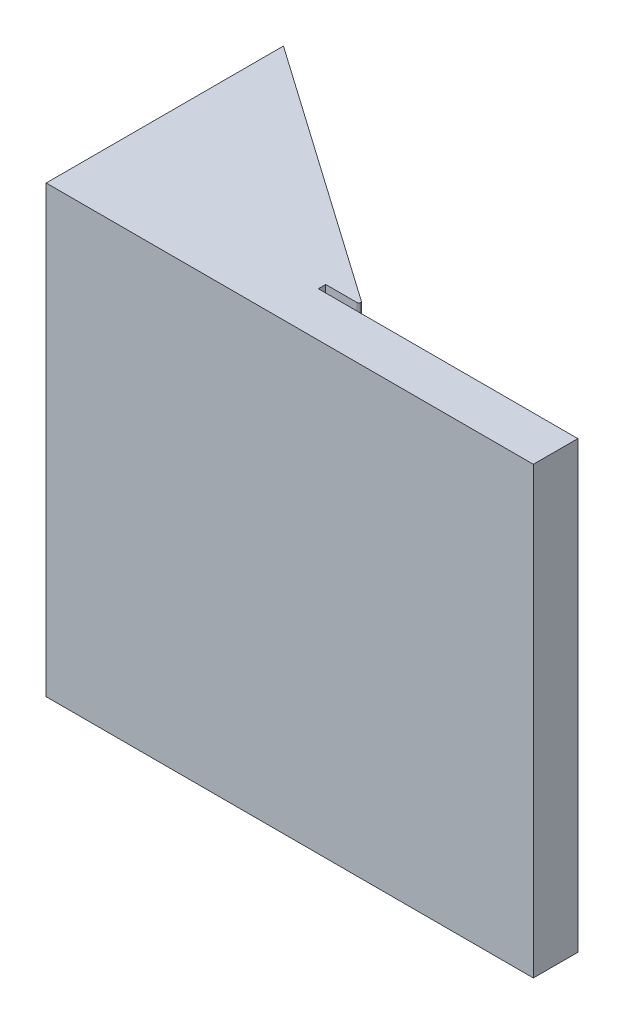
ISO-10303-21;
HEADER;
FILE_DESCRIPTION(('STEP AP214'),'2;1');
FILE_NAME('part.step','',(''),(''),'','','');
FILE_SCHEMA(('AUTOMOTIVE_DESIGN { 1 0 10303 214 1 1 1 1 }'));
ENDSEC;
DATA;
#1=APPLICATION_CONTEXT('core data for automotive mechanical design processes');
#2=APPLICATION_PROTOCOL_DEFINITION('international standard','automotive_design',2000,#1);
#3=PRODUCT_CONTEXT('',#1,'mechanical');
#4=PRODUCT('Part','Part','',(#3));
#5=PRODUCT_RELATED_PRODUCT_CATEGORY('part','',(#4));
#6=PRODUCT_DEFINITION_FORMATION('','',#4);
#7=PRODUCT_DEFINITION_CONTEXT('part definition',#1,'design');
#8=PRODUCT_DEFINITION('design','',#6,#7);
#9=PRODUCT_DEFINITION_SHAPE('','',#8);
#10=(LENGTH_UNIT() NAMED_UNIT(*) SI_UNIT(.MILLI.,.METRE.));
#11=(NAMED_UNIT(*) PLANE_ANGLE_UNIT() SI_UNIT($,.RADIAN.));
#12=(NAMED_UNIT(*) SI_UNIT($,.STERADIAN.) SOLID_ANGLE_UNIT());
#13=UNCERTAINTY_MEASURE_WITH_UNIT(LENGTH_MEASURE(1.E-05),#10,'distance_accuracy_value','');
#14=(GEOMETRIC_REPRESENTATION_CONTEXT(3) GLOBAL_UNCERTAINTY_ASSIGNED_CONTEXT((#13)) GLOBAL_UNIT_ASSIGNED_CONTEXT((#10,
#11,#12)) REPRESENTATION_CONTEXT('',''));
#15=CARTESIAN_POINT('',(0.,0.,0.));
#16=DIRECTION('',(0.,0.,1.));
#17=DIRECTION('',(1.,0.,0.));
#18=AXIS2_PLACEMENT_3D('',#15,#16,#17);
#19=CARTESIAN_POINT('',(-20.,60.,-4.));
#20=DIRECTION('',(-1.,0.,0.));
#21=DIRECTION('',(0.,0.,1.));
#22=AXIS2_PLACEMENT_3D('',#19,#20,#21);
#23=PLANE('',#22);
#24=DIRECTION('',(0.,0.,-1.));
#25=VECTOR('',#24,1.);
#26=CARTESIAN_POINT('',(-20.,0.,-4.));
#27=LINE('',#26,#25);
#28=CARTESIAN_POINT('',(-20.,0.,-3.));
#29=VERTEX_POINT('',#28);
#30=CARTESIAN_POINT('',(-20.,0.,-4.));
#31=VERTEX_POINT('',#30);
#32=EDGE_CURVE('E158',#29,#31,#27,.T.);
#33=ORIENTED_EDGE('',*,*,#32,.T.);
#34=DIRECTION('',(0.,-1.,0.));
#35=VECTOR('',#34,1.);
#36=CARTESIAN_POINT('',(-20.,60.,-4.));
#37=LINE('',#36,#35);
#38=CARTESIAN_POINT('',(-20.,60.,-4.));
#39=VERTEX_POINT('',#38);
#40=EDGE_CURVE('E111',#39,#31,#37,.T.);
#41=ORIENTED_EDGE('',*,*,#40,.F.);
#42=DIRECTION('',(0.,0.,-1.));
#43=VECTOR('',#42,1.);
#44=CARTESIAN_POINT('',(-20.,60.,-4.));
#45=LINE('',#44,#43);
#46=CARTESIAN_POINT('',(-20.,60.,-3.));
#47=VERTEX_POINT('',#46);
#48=EDGE_CURVE('E106',#47,#39,#45,.T.);
#49=ORIENTED_EDGE('',*,*,#48,.F.);
#50=DIRECTION('',(0.,-1.,0.));
#51=VECTOR('',#50,1.);
#52=CARTESIAN_POINT('',(-20.,60.,-3.));
#53=LINE('',#52,#51);
#54=EDGE_CURVE('E109',#47,#29,#53,.T.);
#55=ORIENTED_EDGE('',*,*,#54,.T.);
#56=EDGE_LOOP('',(#33,#41,#49,#55));
#57=FACE_BOUND('',#56,.T.);
#58=ADVANCED_FACE('F41',(#57),#23,.F.);
#59=CARTESIAN_POINT('',(-15.,60.,-4.));
#60=DIRECTION('',(0.,0.,-1.));
#61=DIRECTION('',(-1.,0.,0.));
#62=AXIS2_PLACEMENT_3D('',#59,#60,#61);
#63=PLANE('',#62);
#64=DIRECTION('',(1.,0.,0.));
#65=VECTOR('',#64,1.);
#66=CARTESIAN_POINT('',(-15.,0.,-4.));
#67=LINE('',#66,#65);
#68=CARTESIAN_POINT('',(-15.7928987005908,0.,-4.));
#69=VERTEX_POINT('',#68);
#70=EDGE_CURVE('E156',#31,#69,#67,.T.);
#71=ORIENTED_EDGE('',*,*,#70,.T.);
#72=DIRECTION('',(0.,-1.,0.));
#73=VECTOR('',#72,1.);
#74=CARTESIAN_POINT('',(-15.7928987005908,60.,-4.));
#75=LINE('',#74,#73);
#76=CARTESIAN_POINT('',(-15.7928987005908,60.,-4.));
#77=VERTEX_POINT('',#76);
#78=EDGE_CURVE('E49',#69,#77,#75,.F.);
#79=ORIENTED_EDGE('',*,*,#78,.T.);
#80=DIRECTION('',(1.,0.,0.));
#81=VECTOR('',#80,1.);
#82=CARTESIAN_POINT('',(-15.,60.,-4.));
#83=LINE('',#82,#81);
#84=EDGE_CURVE('E113',#39,#77,#83,.T.);
#85=ORIENTED_EDGE('',*,*,#84,.F.);
#86=ORIENTED_EDGE('',*,*,#40,.T.);
#87=EDGE_LOOP('',(#71,#79,#85,#86));
#88=FACE_BOUND('',#87,.T.);
#89=ADVANCED_FACE('F187',(#88),#63,.F.);
#90=CARTESIAN_POINT('',(-15.,60.,-4.));
#91=DIRECTION('',(-0.573576436351047,0.,0.819152044288991));
#92=DIRECTION('',(0.819152044288991,0.,0.573576436351047));
#93=AXIS2_PLACEMENT_3D('',#90,#91,#92);
#94=PLANE('',#93);
#95=DIRECTION('',(-0.819152044288991,0.,-0.573576436351047));
#96=VECTOR('',#95,1.);
#97=CARTESIAN_POINT('',(-15.,60.,-4.));
#98=LINE('',#97,#96);
#99=CARTESIAN_POINT('',(-15.649504591503,60.,-4.45478801107225));
#100=VERTEX_POINT('',#99);
#101=CARTESIAN_POINT('',(-50.7037001685527,60.,-29.));
#102=VERTEX_POINT('',#101);
#103=EDGE_CURVE('E165',#100,#102,#98,.T.);
#104=ORIENTED_EDGE('',*,*,#103,.F.);
#105=DIRECTION('',(0.,-1.,0.));
#106=VECTOR('',#105,1.);
#107=CARTESIAN_POINT('',(-15.649504591503,60.,-4.45478801107225));
#108=LINE('',#107,#106);
#109=CARTESIAN_POINT('',(-15.649504591503,0.,-4.45478801107225));
#110=VERTEX_POINT('',#109);
#111=EDGE_CURVE('E128',#100,#110,#108,.T.);
#112=ORIENTED_EDGE('',*,*,#111,.T.);
#113=DIRECTION('',(-0.819152044288991,0.,-0.573576436351047));
#114=VECTOR('',#113,1.);
#115=CARTESIAN_POINT('',(-15.,0.,-4.));
#116=LINE('',#115,#114);
#117=CARTESIAN_POINT('',(-50.7037001685527,0.,-29.));
#118=VERTEX_POINT('',#117);
#119=EDGE_CURVE('E154',#110,#118,#116,.T.);
#120=ORIENTED_EDGE('',*,*,#119,.T.);
#121=DIRECTION('',(0.,-1.,0.));
#122=VECTOR('',#121,1.);
#123=CARTESIAN_POINT('',(-50.7037001685527,60.,-29.));
#124=LINE('',#123,#122);
#125=EDGE_CURVE('E132',#102,#118,#124,.T.);
#126=ORIENTED_EDGE('',*,*,#125,.F.);
#127=EDGE_LOOP('',(#104,#112,#120,#126));
#128=FACE_BOUND('',#127,.T.);
#129=ADVANCED_FACE('F172',(#128),#94,.F.);
#130=CARTESIAN_POINT('',(-50.7037001685527,60.,-29.));
#131=DIRECTION('',(1.,0.,0.));
#132=DIRECTION('',(0.,0.,-1.));
#133=AXIS2_PLACEMENT_3D('',#130,#131,#132);
#134=PLANE('',#133);
#135=DIRECTION('',(0.,0.,1.));
#136=VECTOR('',#135,1.);
#137=CARTESIAN_POINT('',(-50.7037001685527,0.,-29.));
#138=LINE('',#137,#136);
#139=CARTESIAN_POINT('',(-50.7037001685527,0.,3.));
#140=VERTEX_POINT('',#139);
#141=EDGE_CURVE('E151',#118,#140,#138,.T.);
#142=ORIENTED_EDGE('',*,*,#141,.T.);
#143=DIRECTION('',(0.,-1.,0.));
#144=VECTOR('',#143,1.);
#145=CARTESIAN_POINT('',(-50.7037001685527,60.,3.));
#146=LINE('',#145,#144);
#147=CARTESIAN_POINT('',(-50.7037001685527,60.,3.));
#148=VERTEX_POINT('',#147);
#149=EDGE_CURVE('E138',#148,#140,#146,.T.);
#150=ORIENTED_EDGE('',*,*,#149,.F.);
#151=DIRECTION('',(0.,0.,1.));
#152=VECTOR('',#151,1.);
#153=CARTESIAN_POINT('',(-50.7037001685527,60.,-29.));
#154=LINE('',#153,#152);
#155=EDGE_CURVE('E163',#102,#148,#154,.T.);
#156=ORIENTED_EDGE('',*,*,#155,.F.);
#157=ORIENTED_EDGE('',*,*,#125,.T.);
#158=EDGE_LOOP('',(#142,#150,#156,#157));
#159=FACE_BOUND('',#158,.T.);
#160=ADVANCED_FACE('F179',(#159),#134,.F.);
#161=CARTESIAN_POINT('',(15.,60.,3.));
#162=DIRECTION('',(0.,0.,-1.));
#163=DIRECTION('',(-1.,0.,0.));
#164=AXIS2_PLACEMENT_3D('',#161,#162,#163);
#165=PLANE('',#164);
#166=DIRECTION('',(1.,0.,0.));
#167=VECTOR('',#166,1.);
#168=CARTESIAN_POINT('',(15.,0.,3.));
#169=LINE('',#168,#167);
#170=CARTESIAN_POINT('',(15.,0.,3.));
#171=VERTEX_POINT('',#170);
#172=EDGE_CURVE('E149',#140,#171,#169,.T.);
#173=ORIENTED_EDGE('',*,*,#172,.T.);
#174=DIRECTION('',(0.,-1.,0.));
#175=VECTOR('',#174,1.);
#176=CARTESIAN_POINT('',(15.,60.,3.));
#177=LINE('',#176,#175);
#178=CARTESIAN_POINT('',(15.,60.,3.));
#179=VERTEX_POINT('',#178);
#180=EDGE_CURVE('E141',#179,#171,#177,.T.);
#181=ORIENTED_EDGE('',*,*,#180,.F.);
#182=DIRECTION('',(1.,0.,0.));
#183=VECTOR('',#182,1.);
#184=CARTESIAN_POINT('',(-50.7037001685527,60.,3.));
#185=LINE('',#184,#183);
#186=EDGE_CURVE('E161',#148,#179,#185,.T.);
#187=ORIENTED_EDGE('',*,*,#186,.F.);
#188=ORIENTED_EDGE('',*,*,#149,.T.);
#189=EDGE_LOOP('',(#173,#181,#187,#188));
#190=FACE_BOUND('',#189,.T.);
#191=ADVANCED_FACE('F183',(#190),#165,.F.);
#192=CARTESIAN_POINT('',(15.,60.,3.));
#193=DIRECTION('',(-1.,0.,0.));
#194=DIRECTION('',(0.,0.,1.));
#195=AXIS2_PLACEMENT_3D('',#192,#193,#194);
#196=PLANE('',#195);
#197=DIRECTION('',(0.,0.,-1.));
#198=VECTOR('',#197,1.);
#199=CARTESIAN_POINT('',(15.,0.,3.));
#200=LINE('',#199,#198);
#201=CARTESIAN_POINT('',(15.,0.,-3.));
#202=VERTEX_POINT('',#201);
#203=EDGE_CURVE('E147',#171,#202,#200,.T.);
#204=ORIENTED_EDGE('',*,*,#203,.T.);
#205=DIRECTION('',(0.,-1.,0.));
#206=VECTOR('',#205,1.);
#207=CARTESIAN_POINT('',(15.,60.,-3.));
#208=LINE('',#207,#206);
#209=CARTESIAN_POINT('',(15.,60.,-3.));
#210=VERTEX_POINT('',#209);
#211=EDGE_CURVE('E144',#210,#202,#208,.T.);
#212=ORIENTED_EDGE('',*,*,#211,.F.);
#213=DIRECTION('',(0.,0.,-1.));
#214=VECTOR('',#213,1.);
#215=CARTESIAN_POINT('',(15.,60.,3.));
#216=LINE('',#215,#214);
#217=EDGE_CURVE('E119',#179,#210,#216,.T.);
#218=ORIENTED_EDGE('',*,*,#217,.F.);
#219=ORIENTED_EDGE('',*,*,#180,.T.);
#220=EDGE_LOOP('',(#204,#212,#218,#219));
#221=FACE_BOUND('',#220,.T.);
#222=ADVANCED_FACE('F186',(#221),#196,.F.);
#223=CARTESIAN_POINT('',(15.,60.,-3.));
#224=DIRECTION('',(0.,0.,1.));
#225=DIRECTION('',(1.,0.,0.));
#226=AXIS2_PLACEMENT_3D('',#223,#224,#225);
#227=PLANE('',#226);
#228=DIRECTION('',(-1.,0.,0.));
#229=VECTOR('',#228,1.);
#230=CARTESIAN_POINT('',(15.,0.,-3.));
#231=LINE('',#230,#229);
#232=EDGE_CURVE('E123',#202,#29,#231,.T.);
#233=ORIENTED_EDGE('',*,*,#232,.T.);
#234=ORIENTED_EDGE('',*,*,#54,.F.);
#235=DIRECTION('',(-1.,0.,0.));
#236=VECTOR('',#235,1.);
#237=CARTESIAN_POINT('',(-20.,60.,-3.));
#238=LINE('',#237,#236);
#239=EDGE_CURVE('E114',#210,#47,#238,.T.);
#240=ORIENTED_EDGE('',*,*,#239,.F.);
#241=ORIENTED_EDGE('',*,*,#211,.T.);
#242=EDGE_LOOP('',(#233,#234,#240,#241));
#243=FACE_BOUND('',#242,.T.);
#244=ADVANCED_FACE('F125',(#243),#227,.F.);
#245=CARTESIAN_POINT('',(0.,60.,0.));
#246=DIRECTION('',(0.,1.,0.));
#247=DIRECTION('',(0.,0.,1.));
#248=AXIS2_PLACEMENT_3D('',#245,#246,#247);
#249=PLANE('',#248);
#250=ORIENTED_EDGE('',*,*,#84,.T.);
#251=CARTESIAN_POINT('',(-15.7928987005908,60.,-4.25));
#252=DIRECTION('',(0.,1.,0.));
#253=DIRECTION('',(0.,0.,1.));
#254=AXIS2_PLACEMENT_3D('',#251,#252,#253);
#255=CIRCLE('',#254,0.25);
#256=EDGE_CURVE('E11',#77,#100,#255,.T.);
#257=ORIENTED_EDGE('',*,*,#256,.T.);
#258=ORIENTED_EDGE('',*,*,#103,.T.);
#259=ORIENTED_EDGE('',*,*,#155,.T.);
#260=ORIENTED_EDGE('',*,*,#186,.T.);
#261=ORIENTED_EDGE('',*,*,#217,.T.);
#262=ORIENTED_EDGE('',*,*,#239,.T.);
#263=ORIENTED_EDGE('',*,*,#48,.T.);
#264=EDGE_LOOP('',(#250,#257,#258,#259,#260,#261,#262,#263));
#265=FACE_BOUND('',#264,.T.);
#266=ADVANCED_FACE('F117',(#265),#249,.T.);
#267=CARTESIAN_POINT('',(0.,0.,0.));
#268=DIRECTION('',(0.,1.,0.));
#269=DIRECTION('',(0.,0.,1.));
#270=AXIS2_PLACEMENT_3D('',#267,#268,#269);
#271=PLANE('',#270);
#272=ORIENTED_EDGE('',*,*,#119,.F.);
#273=CARTESIAN_POINT('',(-15.7928987005908,0.,-4.25));
#274=DIRECTION('',(0.,1.,0.));
#275=DIRECTION('',(0.,0.,1.));
#276=AXIS2_PLACEMENT_3D('',#273,#274,#275);
#277=CIRCLE('',#276,0.25);
#278=EDGE_CURVE('E63',#110,#69,#277,.F.);
#279=ORIENTED_EDGE('',*,*,#278,.T.);
#280=ORIENTED_EDGE('',*,*,#70,.F.);
#281=ORIENTED_EDGE('',*,*,#32,.F.);
#282=ORIENTED_EDGE('',*,*,#232,.F.);
#283=ORIENTED_EDGE('',*,*,#203,.F.);
#284=ORIENTED_EDGE('',*,*,#172,.F.);
#285=ORIENTED_EDGE('',*,*,#141,.F.);
#286=EDGE_LOOP('',(#272,#279,#280,#281,#282,#283,#284,#285));
#287=FACE_BOUND('',#286,.T.);
#288=ADVANCED_FACE('F175',(#287),#271,.F.);
#289=CARTESIAN_POINT('',(-15.7928987005908,60.,-4.25));
#290=DIRECTION('',(0.,-1.,0.));
#291=DIRECTION('',(0.,0.,-1.));
#292=AXIS2_PLACEMENT_3D('',#289,#290,#291);
#293=CYLINDRICAL_SURFACE('',#292,0.25);
#294=ORIENTED_EDGE('',*,*,#256,.F.);
#295=ORIENTED_EDGE('',*,*,#78,.F.);
#296=ORIENTED_EDGE('',*,*,#278,.F.);
#297=ORIENTED_EDGE('',*,*,#111,.F.);
#298=EDGE_LOOP('',(#294,#295,#296,#297));
#299=FACE_BOUND('',#298,.T.);
#300=ADVANCED_FACE('F43',(#299),#293,.T.);
#301=CLOSED_SHELL('',(#58,#89,#129,#160,#191,#222,#244,#266,#288,#300));
#302=MANIFOLD_SOLID_BREP('B2',#301);
#303=ADVANCED_BREP_SHAPE_REPRESENTATION('',(#18,#302),#14);
#304=SHAPE_DEFINITION_REPRESENTATION(#9,#303);
ENDSEC;
END-ISO-10303-21;
